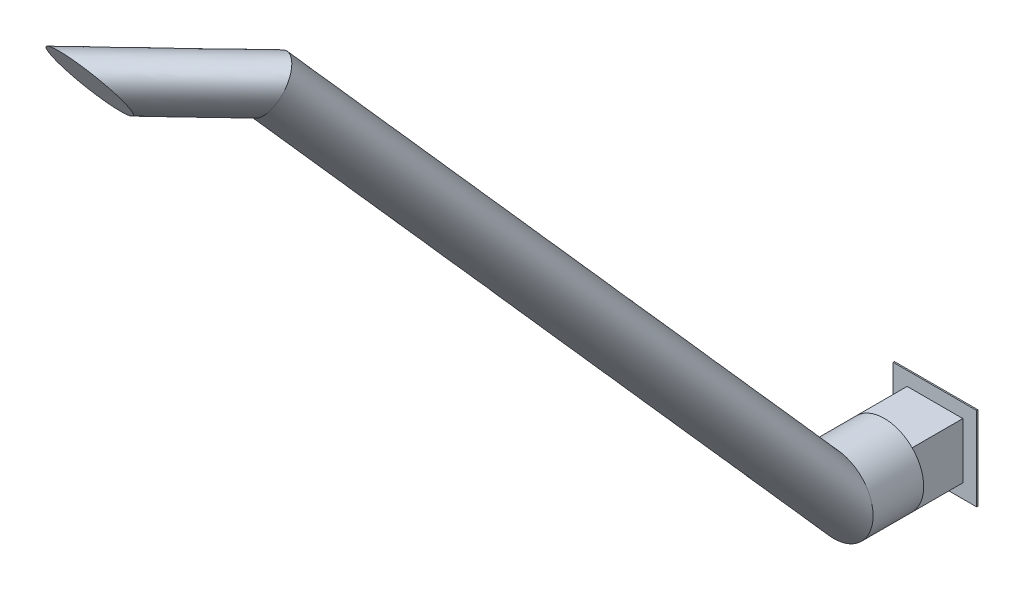
ISO-10303-21;
HEADER;
FILE_DESCRIPTION(('STEP AP214'),'2;1');
FILE_NAME('part.step','',(''),(''),'','','');
FILE_SCHEMA(('AUTOMOTIVE_DESIGN { 1 0 10303 214 1 1 1 1 }'));
ENDSEC;
DATA;
#1=APPLICATION_CONTEXT('core data for automotive mechanical design processes');
#2=APPLICATION_PROTOCOL_DEFINITION('international standard','automotive_design',2000,#1);
#3=PRODUCT_CONTEXT('',#1,'mechanical');
#4=PRODUCT('Part','Part','',(#3));
#5=PRODUCT_RELATED_PRODUCT_CATEGORY('part','',(#4));
#6=PRODUCT_DEFINITION_FORMATION('','',#4);
#7=PRODUCT_DEFINITION_CONTEXT('part definition',#1,'design');
#8=PRODUCT_DEFINITION('design','',#6,#7);
#9=PRODUCT_DEFINITION_SHAPE('','',#8);
#10=(LENGTH_UNIT() NAMED_UNIT(*) SI_UNIT(.MILLI.,.METRE.));
#11=(NAMED_UNIT(*) PLANE_ANGLE_UNIT() SI_UNIT($,.RADIAN.));
#12=(NAMED_UNIT(*) SI_UNIT($,.STERADIAN.) SOLID_ANGLE_UNIT());
#13=UNCERTAINTY_MEASURE_WITH_UNIT(LENGTH_MEASURE(1.E-05),#10,'distance_accuracy_value','');
#14=(GEOMETRIC_REPRESENTATION_CONTEXT(3) GLOBAL_UNCERTAINTY_ASSIGNED_CONTEXT((#13)) GLOBAL_UNIT_ASSIGNED_CONTEXT((#10,
#11,#12)) REPRESENTATION_CONTEXT('',''));
#15=CARTESIAN_POINT('',(0.,0.,0.));
#16=DIRECTION('',(0.,0.,1.));
#17=DIRECTION('',(1.,0.,0.));
#18=AXIS2_PLACEMENT_3D('',#15,#16,#17);
#19=CARTESIAN_POINT('',(0.,0.,2.5));
#20=DIRECTION('',(0.,0.,1.));
#21=DIRECTION('',(1.,0.,0.));
#22=AXIS2_PLACEMENT_3D('',#19,#20,#21);
#23=PLANE('',#22);
#24=DIRECTION('',(0.,-1.,0.));
#25=VECTOR('',#24,1.);
#26=CARTESIAN_POINT('',(0.,0.,2.5));
#27=LINE('',#26,#25);
#28=CARTESIAN_POINT('',(0.,0.,2.5));
#29=VERTEX_POINT('',#28);
#30=CARTESIAN_POINT('',(0.,-165.,2.5));
#31=VERTEX_POINT('',#30);
#32=EDGE_CURVE('E254',#29,#31,#27,.T.);
#33=ORIENTED_EDGE('',*,*,#32,.T.);
#34=DIRECTION('',(1.,0.,0.));
#35=VECTOR('',#34,1.);
#36=CARTESIAN_POINT('',(0.,-165.,2.5));
#37=LINE('',#36,#35);
#38=CARTESIAN_POINT('',(165.,-165.,2.5));
#39=VERTEX_POINT('',#38);
#40=EDGE_CURVE('E267',#31,#39,#37,.T.);
#41=ORIENTED_EDGE('',*,*,#40,.T.);
#42=DIRECTION('',(0.,1.,0.));
#43=VECTOR('',#42,1.);
#44=CARTESIAN_POINT('',(165.,0.,2.5));
#45=LINE('',#44,#43);
#46=CARTESIAN_POINT('',(165.,0.,2.5));
#47=VERTEX_POINT('',#46);
#48=EDGE_CURVE('E247',#39,#47,#45,.T.);
#49=ORIENTED_EDGE('',*,*,#48,.T.);
#50=DIRECTION('',(-1.,0.,0.));
#51=VECTOR('',#50,1.);
#52=CARTESIAN_POINT('',(0.,0.,2.5));
#53=LINE('',#52,#51);
#54=EDGE_CURVE('E261',#47,#29,#53,.T.);
#55=ORIENTED_EDGE('',*,*,#54,.T.);
#56=EDGE_LOOP('',(#33,#41,#49,#55));
#57=FACE_BOUND('',#56,.T.);
#58=DIRECTION('',(0.,-1.,0.));
#59=VECTOR('',#58,1.);
#60=CARTESIAN_POINT('',(27.5,-27.5,2.5));
#61=LINE('',#60,#59);
#62=CARTESIAN_POINT('',(27.5,-27.5,2.5));
#63=VERTEX_POINT('',#62);
#64=CARTESIAN_POINT('',(27.5,-137.5,2.5));
#65=VERTEX_POINT('',#64);
#66=EDGE_CURVE('E283',#63,#65,#61,.T.);
#67=ORIENTED_EDGE('',*,*,#66,.F.);
#68=DIRECTION('',(-1.,0.,0.));
#69=VECTOR('',#68,1.);
#70=CARTESIAN_POINT('',(27.5,-27.5,2.5));
#71=LINE('',#70,#69);
#72=CARTESIAN_POINT('',(137.5,-27.5,2.5));
#73=VERTEX_POINT('',#72);
#74=EDGE_CURVE('E286',#73,#63,#71,.T.);
#75=ORIENTED_EDGE('',*,*,#74,.F.);
#76=DIRECTION('',(0.,1.,0.));
#77=VECTOR('',#76,1.);
#78=CARTESIAN_POINT('',(137.5,-27.5,2.5));
#79=LINE('',#78,#77);
#80=CARTESIAN_POINT('',(137.5,-137.5,2.5));
#81=VERTEX_POINT('',#80);
#82=EDGE_CURVE('E290',#81,#73,#79,.T.);
#83=ORIENTED_EDGE('',*,*,#82,.F.);
#84=DIRECTION('',(1.,0.,0.));
#85=VECTOR('',#84,1.);
#86=CARTESIAN_POINT('',(27.5,-137.5,2.5));
#87=LINE('',#86,#85);
#88=EDGE_CURVE('E287',#65,#81,#87,.T.);
#89=ORIENTED_EDGE('',*,*,#88,.F.);
#90=EDGE_LOOP('',(#67,#75,#83,#89));
#91=FACE_BOUND('',#90,.T.);
#92=ADVANCED_FACE('F32',(#57,#91),#23,.T.);
#93=CARTESIAN_POINT('',(0.,0.,0.));
#94=DIRECTION('',(0.,0.,1.));
#95=DIRECTION('',(1.,0.,0.));
#96=AXIS2_PLACEMENT_3D('',#93,#94,#95);
#97=PLANE('',#96);
#98=DIRECTION('',(0.,-1.,0.));
#99=VECTOR('',#98,1.);
#100=CARTESIAN_POINT('',(0.,0.,0.));
#101=LINE('',#100,#99);
#102=CARTESIAN_POINT('',(0.,0.,0.));
#103=VERTEX_POINT('',#102);
#104=CARTESIAN_POINT('',(0.,-165.,0.));
#105=VERTEX_POINT('',#104);
#106=EDGE_CURVE('E243',#103,#105,#101,.T.);
#107=ORIENTED_EDGE('',*,*,#106,.F.);
#108=DIRECTION('',(-1.,0.,0.));
#109=VECTOR('',#108,1.);
#110=CARTESIAN_POINT('',(0.,0.,0.));
#111=LINE('',#110,#109);
#112=CARTESIAN_POINT('',(165.,0.,0.));
#113=VERTEX_POINT('',#112);
#114=EDGE_CURVE('E252',#113,#103,#111,.T.);
#115=ORIENTED_EDGE('',*,*,#114,.F.);
#116=DIRECTION('',(0.,1.,0.));
#117=VECTOR('',#116,1.);
#118=CARTESIAN_POINT('',(165.,0.,0.));
#119=LINE('',#118,#117);
#120=CARTESIAN_POINT('',(165.,-165.,0.));
#121=VERTEX_POINT('',#120);
#122=EDGE_CURVE('E242',#121,#113,#119,.T.);
#123=ORIENTED_EDGE('',*,*,#122,.F.);
#124=DIRECTION('',(1.,0.,0.));
#125=VECTOR('',#124,1.);
#126=CARTESIAN_POINT('',(0.,-165.,0.));
#127=LINE('',#126,#125);
#128=EDGE_CURVE('E235',#105,#121,#127,.T.);
#129=ORIENTED_EDGE('',*,*,#128,.F.);
#130=EDGE_LOOP('',(#107,#115,#123,#129));
#131=FACE_BOUND('',#130,.T.);
#132=DIRECTION('',(0.,1.,0.));
#133=VECTOR('',#132,1.);
#134=CARTESIAN_POINT('',(135.,-135.,0.));
#135=LINE('',#134,#133);
#136=CARTESIAN_POINT('',(135.,-135.,0.));
#137=VERTEX_POINT('',#136);
#138=CARTESIAN_POINT('',(135.,-30.,0.));
#139=VERTEX_POINT('',#138);
#140=EDGE_CURVE('E56',#137,#139,#135,.T.);
#141=ORIENTED_EDGE('',*,*,#140,.T.);
#142=DIRECTION('',(-1.,0.,0.));
#143=VECTOR('',#142,1.);
#144=CARTESIAN_POINT('',(30.,-30.,0.));
#145=LINE('',#144,#143);
#146=CARTESIAN_POINT('',(30.,-30.,0.));
#147=VERTEX_POINT('',#146);
#148=EDGE_CURVE('E308',#139,#147,#145,.T.);
#149=ORIENTED_EDGE('',*,*,#148,.T.);
#150=DIRECTION('',(0.,-1.,0.));
#151=VECTOR('',#150,1.);
#152=CARTESIAN_POINT('',(30.,-135.,0.));
#153=LINE('',#152,#151);
#154=CARTESIAN_POINT('',(30.,-135.,0.));
#155=VERTEX_POINT('',#154);
#156=EDGE_CURVE('E311',#147,#155,#153,.T.);
#157=ORIENTED_EDGE('',*,*,#156,.T.);
#158=DIRECTION('',(1.,0.,0.));
#159=VECTOR('',#158,1.);
#160=CARTESIAN_POINT('',(30.,-135.,0.));
#161=LINE('',#160,#159);
#162=EDGE_CURVE('E314',#155,#137,#161,.T.);
#163=ORIENTED_EDGE('',*,*,#162,.T.);
#164=EDGE_LOOP('',(#141,#149,#157,#163));
#165=FACE_BOUND('',#164,.T.);
#166=ADVANCED_FACE('F216',(#131,#165),#97,.F.);
#167=CARTESIAN_POINT('',(0.,0.,2.5));
#168=DIRECTION('',(1.,0.,0.));
#169=DIRECTION('',(0.,1.,0.));
#170=AXIS2_PLACEMENT_3D('',#167,#168,#169);
#171=PLANE('',#170);
#172=ORIENTED_EDGE('',*,*,#106,.T.);
#173=DIRECTION('',(0.,0.,-1.));
#174=VECTOR('',#173,1.);
#175=CARTESIAN_POINT('',(0.,-165.,2.5));
#176=LINE('',#175,#174);
#177=EDGE_CURVE('E11',#31,#105,#176,.T.);
#178=ORIENTED_EDGE('',*,*,#177,.F.);
#179=ORIENTED_EDGE('',*,*,#32,.F.);
#180=DIRECTION('',(0.,0.,-1.));
#181=VECTOR('',#180,1.);
#182=CARTESIAN_POINT('',(0.,0.,2.5));
#183=LINE('',#182,#181);
#184=EDGE_CURVE('E258',#29,#103,#183,.T.);
#185=ORIENTED_EDGE('',*,*,#184,.T.);
#186=EDGE_LOOP('',(#172,#178,#179,#185));
#187=FACE_BOUND('',#186,.T.);
#188=ADVANCED_FACE('F34',(#187),#171,.F.);
#189=CARTESIAN_POINT('',(0.,-165.,2.5));
#190=DIRECTION('',(0.,1.,0.));
#191=DIRECTION('',(0.,0.,1.));
#192=AXIS2_PLACEMENT_3D('',#189,#190,#191);
#193=PLANE('',#192);
#194=ORIENTED_EDGE('',*,*,#128,.T.);
#195=DIRECTION('',(0.,0.,-1.));
#196=VECTOR('',#195,1.);
#197=CARTESIAN_POINT('',(165.,-165.,2.5));
#198=LINE('',#197,#196);
#199=EDGE_CURVE('E41',#39,#121,#198,.T.);
#200=ORIENTED_EDGE('',*,*,#199,.F.);
#201=ORIENTED_EDGE('',*,*,#40,.F.);
#202=ORIENTED_EDGE('',*,*,#177,.T.);
#203=EDGE_LOOP('',(#194,#200,#201,#202));
#204=FACE_BOUND('',#203,.T.);
#205=ADVANCED_FACE('F226',(#204),#193,.F.);
#206=CARTESIAN_POINT('',(165.,0.,2.5));
#207=DIRECTION('',(-1.,0.,0.));
#208=DIRECTION('',(0.,-1.,0.));
#209=AXIS2_PLACEMENT_3D('',#206,#207,#208);
#210=PLANE('',#209);
#211=ORIENTED_EDGE('',*,*,#122,.T.);
#212=DIRECTION('',(0.,0.,-1.));
#213=VECTOR('',#212,1.);
#214=CARTESIAN_POINT('',(165.,0.,2.5));
#215=LINE('',#214,#213);
#216=EDGE_CURVE('E248',#47,#113,#215,.T.);
#217=ORIENTED_EDGE('',*,*,#216,.F.);
#218=ORIENTED_EDGE('',*,*,#48,.F.);
#219=ORIENTED_EDGE('',*,*,#199,.T.);
#220=EDGE_LOOP('',(#211,#217,#218,#219));
#221=FACE_BOUND('',#220,.T.);
#222=ADVANCED_FACE('F223',(#221),#210,.F.);
#223=CARTESIAN_POINT('',(0.,0.,2.5));
#224=DIRECTION('',(0.,-1.,0.));
#225=DIRECTION('',(0.,0.,-1.));
#226=AXIS2_PLACEMENT_3D('',#223,#224,#225);
#227=PLANE('',#226);
#228=ORIENTED_EDGE('',*,*,#114,.T.);
#229=ORIENTED_EDGE('',*,*,#184,.F.);
#230=ORIENTED_EDGE('',*,*,#54,.F.);
#231=ORIENTED_EDGE('',*,*,#216,.T.);
#232=EDGE_LOOP('',(#228,#229,#230,#231));
#233=FACE_BOUND('',#232,.T.);
#234=ADVANCED_FACE('F213',(#233),#227,.F.);
#235=CARTESIAN_POINT('',(135.,-135.,2.5));
#236=DIRECTION('',(-1.,0.,0.));
#237=DIRECTION('',(0.,0.,1.));
#238=AXIS2_PLACEMENT_3D('',#235,#236,#237);
#239=PLANE('',#238);
#240=ORIENTED_EDGE('',*,*,#140,.F.);
#241=DIRECTION('',(0.,0.,-1.));
#242=VECTOR('',#241,1.);
#243=CARTESIAN_POINT('',(135.,-135.,2.5));
#244=LINE('',#243,#242);
#245=CARTESIAN_POINT('',(135.,-135.,102.5));
#246=VERTEX_POINT('',#245);
#247=EDGE_CURVE('E317',#246,#137,#244,.T.);
#248=ORIENTED_EDGE('',*,*,#247,.F.);
#249=DIRECTION('',(0.,1.,0.));
#250=VECTOR('',#249,1.);
#251=CARTESIAN_POINT('',(135.,-30.,102.5));
#252=LINE('',#251,#250);
#253=CARTESIAN_POINT('',(135.,-30.,102.5));
#254=VERTEX_POINT('',#253);
#255=EDGE_CURVE('E327',#246,#254,#252,.T.);
#256=ORIENTED_EDGE('',*,*,#255,.T.);
#257=DIRECTION('',(0.,0.,-1.));
#258=VECTOR('',#257,1.);
#259=CARTESIAN_POINT('',(135.,-30.,2.5));
#260=LINE('',#259,#258);
#261=EDGE_CURVE('E270',#254,#139,#260,.T.);
#262=ORIENTED_EDGE('',*,*,#261,.T.);
#263=EDGE_LOOP('',(#240,#248,#256,#262));
#264=FACE_BOUND('',#263,.T.);
#265=ADVANCED_FACE('F209',(#264),#239,.T.);
#266=CARTESIAN_POINT('',(30.,-30.,2.5));
#267=DIRECTION('',(0.,-1.,0.));
#268=DIRECTION('',(0.,0.,-1.));
#269=AXIS2_PLACEMENT_3D('',#266,#267,#268);
#270=PLANE('',#269);
#271=ORIENTED_EDGE('',*,*,#148,.F.);
#272=ORIENTED_EDGE('',*,*,#261,.F.);
#273=DIRECTION('',(-1.,0.,0.));
#274=VECTOR('',#273,1.);
#275=CARTESIAN_POINT('',(30.,-30.,102.5));
#276=LINE('',#275,#274);
#277=CARTESIAN_POINT('',(30.,-30.,102.5));
#278=VERTEX_POINT('',#277);
#279=EDGE_CURVE('E292',#254,#278,#276,.T.);
#280=ORIENTED_EDGE('',*,*,#279,.T.);
#281=DIRECTION('',(0.,0.,-1.));
#282=VECTOR('',#281,1.);
#283=CARTESIAN_POINT('',(30.,-30.,2.5));
#284=LINE('',#283,#282);
#285=EDGE_CURVE('E271',#278,#147,#284,.T.);
#286=ORIENTED_EDGE('',*,*,#285,.T.);
#287=EDGE_LOOP('',(#271,#272,#280,#286));
#288=FACE_BOUND('',#287,.T.);
#289=ADVANCED_FACE('F205',(#288),#270,.T.);
#290=CARTESIAN_POINT('',(30.,-135.,2.5));
#291=DIRECTION('',(1.,0.,0.));
#292=DIRECTION('',(0.,0.,-1.));
#293=AXIS2_PLACEMENT_3D('',#290,#291,#292);
#294=PLANE('',#293);
#295=ORIENTED_EDGE('',*,*,#156,.F.);
#296=ORIENTED_EDGE('',*,*,#285,.F.);
#297=DIRECTION('',(0.,-1.,0.));
#298=VECTOR('',#297,1.);
#299=CARTESIAN_POINT('',(30.,-30.,102.5));
#300=LINE('',#299,#298);
#301=CARTESIAN_POINT('',(30.,-135.,102.5));
#302=VERTEX_POINT('',#301);
#303=EDGE_CURVE('E323',#278,#302,#300,.T.);
#304=ORIENTED_EDGE('',*,*,#303,.T.);
#305=DIRECTION('',(0.,0.,-1.));
#306=VECTOR('',#305,1.);
#307=CARTESIAN_POINT('',(30.,-135.,2.5));
#308=LINE('',#307,#306);
#309=EDGE_CURVE('E275',#302,#155,#308,.T.);
#310=ORIENTED_EDGE('',*,*,#309,.T.);
#311=EDGE_LOOP('',(#295,#296,#304,#310));
#312=FACE_BOUND('',#311,.T.);
#313=ADVANCED_FACE('F201',(#312),#294,.T.);
#314=CARTESIAN_POINT('',(30.,-135.,2.5));
#315=DIRECTION('',(0.,1.,0.));
#316=DIRECTION('',(0.,0.,1.));
#317=AXIS2_PLACEMENT_3D('',#314,#315,#316);
#318=PLANE('',#317);
#319=ORIENTED_EDGE('',*,*,#162,.F.);
#320=ORIENTED_EDGE('',*,*,#309,.F.);
#321=DIRECTION('',(1.,0.,0.));
#322=VECTOR('',#321,1.);
#323=CARTESIAN_POINT('',(30.,-135.,102.5));
#324=LINE('',#323,#322);
#325=EDGE_CURVE('E329',#302,#246,#324,.T.);
#326=ORIENTED_EDGE('',*,*,#325,.T.);
#327=ORIENTED_EDGE('',*,*,#247,.T.);
#328=EDGE_LOOP('',(#319,#320,#326,#327));
#329=FACE_BOUND('',#328,.T.);
#330=ADVANCED_FACE('F197',(#329),#318,.T.);
#331=CARTESIAN_POINT('',(27.5,-27.5,102.5));
#332=DIRECTION('',(0.,-1.,0.));
#333=DIRECTION('',(0.,0.,-1.));
#334=AXIS2_PLACEMENT_3D('',#331,#332,#333);
#335=PLANE('',#334);
#336=ORIENTED_EDGE('',*,*,#74,.T.);
#337=DIRECTION('',(0.,0.,-1.));
#338=VECTOR('',#337,1.);
#339=CARTESIAN_POINT('',(27.5,-27.5,102.5));
#340=LINE('',#339,#338);
#341=CARTESIAN_POINT('',(27.5,-27.5,102.5));
#342=VERTEX_POINT('',#341);
#343=EDGE_CURVE('E305',#342,#63,#340,.T.);
#344=ORIENTED_EDGE('',*,*,#343,.F.);
#345=DIRECTION('',(-1.,0.,0.));
#346=VECTOR('',#345,1.);
#347=CARTESIAN_POINT('',(27.5,-27.5,102.5));
#348=LINE('',#347,#346);
#349=CARTESIAN_POINT('',(137.5,-27.5,102.5));
#350=VERTEX_POINT('',#349);
#351=EDGE_CURVE('E297',#350,#342,#348,.T.);
#352=ORIENTED_EDGE('',*,*,#351,.F.);
#353=DIRECTION('',(0.,0.,-1.));
#354=VECTOR('',#353,1.);
#355=CARTESIAN_POINT('',(137.5,-27.5,102.5));
#356=LINE('',#355,#354);
#357=EDGE_CURVE('E298',#350,#73,#356,.T.);
#358=ORIENTED_EDGE('',*,*,#357,.T.);
#359=EDGE_LOOP('',(#336,#344,#352,#358));
#360=FACE_BOUND('',#359,.T.);
#361=ADVANCED_FACE('F193',(#360),#335,.F.);
#362=CARTESIAN_POINT('',(27.5,-27.5,102.5));
#363=DIRECTION('',(1.,0.,0.));
#364=DIRECTION('',(0.,0.,-1.));
#365=AXIS2_PLACEMENT_3D('',#362,#363,#364);
#366=PLANE('',#365);
#367=ORIENTED_EDGE('',*,*,#66,.T.);
#368=DIRECTION('',(0.,0.,-1.));
#369=VECTOR('',#368,1.);
#370=CARTESIAN_POINT('',(27.5,-137.5,102.5));
#371=LINE('',#370,#369);
#372=CARTESIAN_POINT('',(27.5,-137.5,102.5));
#373=VERTEX_POINT('',#372);
#374=EDGE_CURVE('E303',#373,#65,#371,.T.);
#375=ORIENTED_EDGE('',*,*,#374,.F.);
#376=DIRECTION('',(0.,-1.,0.));
#377=VECTOR('',#376,1.);
#378=CARTESIAN_POINT('',(27.5,-27.5,102.5));
#379=LINE('',#378,#377);
#380=EDGE_CURVE('E335',#342,#373,#379,.T.);
#381=ORIENTED_EDGE('',*,*,#380,.F.);
#382=ORIENTED_EDGE('',*,*,#343,.T.);
#383=EDGE_LOOP('',(#367,#375,#381,#382));
#384=FACE_BOUND('',#383,.T.);
#385=ADVANCED_FACE('F189',(#384),#366,.F.);
#386=CARTESIAN_POINT('',(27.5,-137.5,102.5));
#387=DIRECTION('',(0.,1.,0.));
#388=DIRECTION('',(0.,0.,1.));
#389=AXIS2_PLACEMENT_3D('',#386,#387,#388);
#390=PLANE('',#389);
#391=ORIENTED_EDGE('',*,*,#88,.T.);
#392=DIRECTION('',(0.,0.,-1.));
#393=VECTOR('',#392,1.);
#394=CARTESIAN_POINT('',(137.5,-137.5,102.5));
#395=LINE('',#394,#393);
#396=CARTESIAN_POINT('',(137.5,-137.5,102.5));
#397=VERTEX_POINT('',#396);
#398=EDGE_CURVE('E48',#397,#81,#395,.T.);
#399=ORIENTED_EDGE('',*,*,#398,.F.);
#400=DIRECTION('',(1.,0.,0.));
#401=VECTOR('',#400,1.);
#402=CARTESIAN_POINT('',(27.5,-137.5,102.5));
#403=LINE('',#402,#401);
#404=EDGE_CURVE('E338',#373,#397,#403,.T.);
#405=ORIENTED_EDGE('',*,*,#404,.F.);
#406=ORIENTED_EDGE('',*,*,#374,.T.);
#407=EDGE_LOOP('',(#391,#399,#405,#406));
#408=FACE_BOUND('',#407,.T.);
#409=ADVANCED_FACE('F186',(#408),#390,.F.);
#410=CARTESIAN_POINT('',(137.5,-27.5,102.5));
#411=DIRECTION('',(-1.,0.,0.));
#412=DIRECTION('',(0.,0.,1.));
#413=AXIS2_PLACEMENT_3D('',#410,#411,#412);
#414=PLANE('',#413);
#415=ORIENTED_EDGE('',*,*,#82,.T.);
#416=ORIENTED_EDGE('',*,*,#357,.F.);
#417=DIRECTION('',(0.,1.,0.));
#418=VECTOR('',#417,1.);
#419=CARTESIAN_POINT('',(137.5,-27.5,102.5));
#420=LINE('',#419,#418);
#421=EDGE_CURVE('E301',#397,#350,#420,.T.);
#422=ORIENTED_EDGE('',*,*,#421,.F.);
#423=ORIENTED_EDGE('',*,*,#398,.T.);
#424=EDGE_LOOP('',(#415,#416,#422,#423));
#425=FACE_BOUND('',#424,.T.);
#426=ADVANCED_FACE('F183',(#425),#414,.F.);
#427=CARTESIAN_POINT('',(82.5,-82.5,102.5));
#428=DIRECTION('',(0.,0.,1.));
#429=DIRECTION('',(1.,0.,0.));
#430=AXIS2_PLACEMENT_3D('',#427,#428,#429);
#431=PLANE('',#430);
#432=ORIENTED_EDGE('',*,*,#303,.F.);
#433=ORIENTED_EDGE('',*,*,#279,.F.);
#434=ORIENTED_EDGE('',*,*,#255,.F.);
#435=ORIENTED_EDGE('',*,*,#325,.F.);
#436=EDGE_LOOP('',(#432,#433,#434,#435));
#437=FACE_BOUND('',#436,.T.);
#438=ADVANCED_FACE('F178',(#437),#431,.F.);
#439=CARTESIAN_POINT('',(82.5,-82.5,102.5));
#440=DIRECTION('',(0.,0.,1.));
#441=DIRECTION('',(1.,0.,0.));
#442=AXIS2_PLACEMENT_3D('',#439,#440,#441);
#443=CIRCLE('',#442,77.7817459305202);
#444=EDGE_CURVE('E138',#350,#342,#443,.T.);
#445=ORIENTED_EDGE('',*,*,#444,.F.);
#446=ORIENTED_EDGE('',*,*,#351,.T.);
#447=EDGE_LOOP('',(#445,#446));
#448=FACE_BOUND('',#447,.T.);
#449=ADVANCED_FACE('F177',(#448),#431,.F.);
#450=EDGE_CURVE('E351',#342,#373,#443,.T.);
#451=ORIENTED_EDGE('',*,*,#450,.F.);
#452=ORIENTED_EDGE('',*,*,#380,.T.);
#453=EDGE_LOOP('',(#451,#452));
#454=FACE_BOUND('',#453,.T.);
#455=ADVANCED_FACE('F354',(#454),#431,.F.);
#456=EDGE_CURVE('E136',#373,#397,#443,.T.);
#457=ORIENTED_EDGE('',*,*,#456,.F.);
#458=ORIENTED_EDGE('',*,*,#404,.T.);
#459=EDGE_LOOP('',(#457,#458));
#460=FACE_BOUND('',#459,.T.);
#461=ADVANCED_FACE('F181',(#460),#431,.F.);
#462=CARTESIAN_POINT('',(82.5,-82.5,202.5));
#463=DIRECTION('',(0.,0.,-1.));
#464=DIRECTION('',(-1.,0.,0.));
#465=AXIS2_PLACEMENT_3D('',#462,#463,#464);
#466=CYLINDRICAL_SURFACE('',#465,77.7817459305202);
#467=CARTESIAN_POINT('',(82.5,-82.5,202.5));
#468=DIRECTION('',(0.,0.,1.));
#469=DIRECTION('',(1.,0.,0.));
#470=AXIS2_PLACEMENT_3D('',#467,#468,#469);
#471=CIRCLE('',#470,77.7817459305202);
#472=CARTESIAN_POINT('',(160.28174593052,-82.5,202.5));
#473=VERTEX_POINT('',#472);
#474=EDGE_CURVE('E36',#473,#473,#471,.T.);
#475=ORIENTED_EDGE('',*,*,#474,.F.);
#476=EDGE_LOOP('',(#475));
#477=FACE_BOUND('',#476,.T.);
#478=ORIENTED_EDGE('',*,*,#444,.T.);
#479=ORIENTED_EDGE('',*,*,#450,.T.);
#480=ORIENTED_EDGE('',*,*,#456,.T.);
#481=EDGE_CURVE('E132',#397,#350,#443,.T.);
#482=ORIENTED_EDGE('',*,*,#481,.T.);
#483=EDGE_LOOP('',(#478,#479,#480,#482));
#484=FACE_BOUND('',#483,.T.);
#485=ADVANCED_FACE('F175',(#477,#484),#466,.T.);
#486=ORIENTED_EDGE('',*,*,#481,.F.);
#487=ORIENTED_EDGE('',*,*,#421,.T.);
#488=EDGE_LOOP('',(#486,#487));
#489=FACE_BOUND('',#488,.T.);
#490=ADVANCED_FACE('F154',(#489),#431,.F.);
#491=CARTESIAN_POINT('',(-499.65420624568,774.591548600483,1089.67792133919));
#492=DIRECTION('',(-0.048571803509788,-0.562168981128697,0.82559482590465));
#493=DIRECTION('',(0.808383262570436,0.463354338060489,0.363069219566328));
#494=AXIS2_PLACEMENT_3D('',#491,#492,#493);
#495=PLANE('',#494);
#496=CARTESIAN_POINT('',(-499.65420624568,774.591548600483,1089.67792133919));
#497=DIRECTION('',(-0.048571803509788,-0.562168981128697,0.82559482590465));
#498=DIRECTION('',(0.808383262570436,0.463354338060489,0.363069219566328));
#499=AXIS2_PLACEMENT_3D('',#496,#497,#498);
#500=CIRCLE('',#499,77.7817459305202);
#501=CARTESIAN_POINT('',(-436.776744701941,810.632057999309,1117.91807913069));
#502=VERTEX_POINT('',#501);
#503=EDGE_CURVE('E133',#502,#502,#500,.T.);
#504=ORIENTED_EDGE('',*,*,#503,.T.);
#505=EDGE_LOOP('',(#504));
#506=FACE_BOUND('',#505,.T.);
#507=ADVANCED_FACE('F164',(#506),#495,.T.);
#508=CARTESIAN_POINT('',(-283.407466885606,868.205686274757,995.28380440967));
#509=CARTESIAN_POINT('',(160.28174593052,-82.5,202.5));
#510=CARTESIAN_POINT('',(-283.407466885606,1023.7691781358,995.283804409671));
#511=CARTESIAN_POINT('',(160.28174593052,73.0634918610403,202.5));
#512=CARTESIAN_POINT('',(-438.970958746646,1023.7691781358,995.283804409671));
#513=CARTESIAN_POINT('',(4.71825406947979,73.0634918610403,202.5));
#514=CARTESIAN_POINT('',(-438.970958746646,868.205686274757,995.28380440967));
#515=CARTESIAN_POINT('',(4.71825406947979,-82.5,202.5));
#516=CARTESIAN_POINT('',(-438.970958746646,712.642194413717,995.283804409671));
#517=CARTESIAN_POINT('',(4.71825406947979,-238.06349186104,202.5));
#518=CARTESIAN_POINT('',(-283.407466885606,712.642194413717,995.283804409671));
#519=CARTESIAN_POINT('',(160.28174593052,-238.06349186104,202.5));
#520=CARTESIAN_POINT('',(-283.407466885606,868.205686274757,995.28380440967));
#521=CARTESIAN_POINT('',(160.28174593052,-82.5,202.5));
#522=(BOUNDED_SURFACE() B_SPLINE_SURFACE(3,1,((#508,#509),(#510,#511),(#512,#513),(#514,#515),
(#516,#517),(#518,#519),(#520,#521)),.UNSPECIFIED.,.T.,.F.,.F.) B_SPLINE_SURFACE_WITH_KNOTS((4,
3,4),(2,2),(0.,0.5,1.),(0.,1.),
.UNSPECIFIED.) GEOMETRIC_REPRESENTATION_ITEM() RATIONAL_B_SPLINE_SURFACE(((1.,1.),
(0.333333333333333,0.333333333333333),(0.333333333333333,0.333333333333333),(1.,1.),
(0.333333333333333,0.333333333333333),(0.333333333333333,0.333333333333333),(1.,1.))) REPRESENTATION_ITEM('') SURFACE());
#523=CARTESIAN_POINT('',(-256.538165294914,810.632057999308,947.273741235727));
#524=CARTESIAN_POINT('',(-256.758852070678,809.603591299644,947.668067438799));
#525=CARTESIAN_POINT('',(-257.009801152548,808.572627135929,948.038849921184));
#526=CARTESIAN_POINT('',(-257.565525044,806.50984597856,948.73652813465));
#527=CARTESIAN_POINT('',(-257.870330450984,805.478028833742,949.063398731248));
#528=CARTESIAN_POINT('',(-258.527777853545,803.417334250116,949.676064722783));
#529=CARTESIAN_POINT('',(-258.88042853164,802.388457379566,949.961852642985));
#530=CARTESIAN_POINT('',(-259.629259121431,800.333968310309,950.495721446527));
#531=CARTESIAN_POINT('',(-260.025539534896,799.308369495668,950.743711994957));
#532=CARTESIAN_POINT('',(-260.856395544356,797.265042902576,951.203719275354));
#533=CARTESIAN_POINT('',(-261.290961283904,796.247313171219,951.415745225423));
#534=CARTESIAN_POINT('',(-262.194701300239,794.220788782587,951.806265786733));
#535=CARTESIAN_POINT('',(-262.66387797678,793.211994750312,951.984758069864));
#536=CARTESIAN_POINT('',(-263.553895127708,791.369372386172,952.283554057838));
#537=CARTESIAN_POINT('',(-263.970017843759,790.534020509866,952.40859986279));
#538=CARTESIAN_POINT('',(-264.822503836054,788.870766595987,952.63783473242));
#539=CARTESIAN_POINT('',(-265.258868265922,788.04286498624,952.742022606549));
#540=CARTESIAN_POINT('',(-266.150558646001,786.394540411762,952.930579693158));
#541=CARTESIAN_POINT('',(-266.605893743845,785.574121293021,953.014939211116));
#542=CARTESIAN_POINT('',(-267.534035591196,783.941455447113,953.164678886628));
#543=CARTESIAN_POINT('',(-268.00684328103,783.129209162788,953.230058021028));
#544=CARTESIAN_POINT('',(-269.449827786908,780.704906874028,953.398983378044));
#545=CARTESIAN_POINT('',(-270.44450012618,779.105408699482,953.475303939943));
#546=CARTESIAN_POINT('',(-272.492760154639,775.939176378207,953.561028699336));
#547=CARTESIAN_POINT('',(-273.546445334993,774.372502697147,953.570318664793));
#548=CARTESIAN_POINT('',(-275.704635084518,771.276188597164,953.526263197408));
#549=CARTESIAN_POINT('',(-276.809125472079,769.746538023501,953.472935142845));
#550=CARTESIAN_POINT('',(-279.064118253119,766.724705560885,953.307362050343));
#551=CARTESIAN_POINT('',(-280.214623459868,765.232525971952,953.195113404995));
#552=CARTESIAN_POINT('',(-282.220808328396,762.709865475229,952.954941768875));
#553=CARTESIAN_POINT('',(-283.066251911608,761.669878250981,952.840781752363));
#554=CARTESIAN_POINT('',(-284.777058197141,759.609799248451,952.584896982976));
#555=CARTESIAN_POINT('',(-285.642421533037,758.589708104902,952.443171352267));
#556=CARTESIAN_POINT('',(-287.392134085177,756.569554266115,952.13285003661));
#557=CARTESIAN_POINT('',(-288.276489158298,755.569497938684,951.96424595656));
#558=CARTESIAN_POINT('',(-290.062933541871,753.590131158144,951.600797424707));
#559=CARTESIAN_POINT('',(-290.965023659722,752.610821653784,951.405951775864));
#560=CARTESIAN_POINT('',(-292.786186280878,750.673260291136,950.990465125096));
#561=CARTESIAN_POINT('',(-293.705262746343,749.715013462922,950.769818039241));
#562=CARTESIAN_POINT('',(-295.559403570618,747.820323236403,950.303130358326));
#563=CARTESIAN_POINT('',(-296.494468760682,746.883880977732,950.057088439619));
#564=CARTESIAN_POINT('',(-298.379599074064,745.03366097893,949.539942950869));
#565=CARTESIAN_POINT('',(-299.329661281289,744.119878919358,949.268844204413));
#566=CARTESIAN_POINT('',(-301.244213887971,742.315557353937,948.701732446592));
#567=CARTESIAN_POINT('',(-302.20870353812,741.425016647564,948.405720725448));
#568=CARTESIAN_POINT('',(-304.151278040073,739.668156656092,947.788921157872));
#569=CARTESIAN_POINT('',(-305.129359567414,738.801831598886,947.468139285503));
#570=CARTESIAN_POINT('',(-307.098689629349,737.094149759581,946.801733902525));
#571=CARTESIAN_POINT('',(-308.089937572306,736.252791861031,946.456111505074));
#572=CARTESIAN_POINT('',(-310.084741906097,734.596328103453,945.740013460578));
#573=CARTESIAN_POINT('',(-311.088294230953,733.78121387874,945.369545851885));
#574=CARTESIAN_POINT('',(-313.107398928202,732.178206610841,944.603468592523));
#575=CARTESIAN_POINT('',(-314.122950894839,731.390312650742,944.207859790013));
#576=CARTESIAN_POINT('',(-316.516417600772,729.577290922468,943.250889004726));
#577=CARTESIAN_POINT('',(-317.898969689224,728.563645071012,942.679271791261));
#578=CARTESIAN_POINT('',(-320.683211196091,726.591936762669,941.489122009219));
#579=CARTESIAN_POINT('',(-322.084899002223,725.633869658256,940.87059337341));
#580=CARTESIAN_POINT('',(-324.906259540184,723.77778483298,939.585068415825));
#581=CARTESIAN_POINT('',(-326.325935780618,722.879779048266,938.918062514664));
#582=CARTESIAN_POINT('',(-329.178213638005,721.151605525647,937.535389461984));
#583=CARTESIAN_POINT('',(-330.610783045269,720.321303362321,936.819824173449));
#584=CARTESIAN_POINT('',(-333.489357955041,718.733599457579,935.336775086848));
#585=CARTESIAN_POINT('',(-334.935361514521,717.976187348409,934.569298699047));
#586=CARTESIAN_POINT('',(-337.111863896865,716.901466934786,933.377505364536));
#587=CARTESIAN_POINT('',(-337.838499607484,716.553509533443,932.973544353499));
#588=CARTESIAN_POINT('',(-339.293932669919,715.879283668668,932.15168892665));
#589=CARTESIAN_POINT('',(-340.022729922344,715.553014223652,931.733795142715));
#590=CARTESIAN_POINT('',(-341.619233870648,714.864368039565,930.803744725827));
#591=CARTESIAN_POINT('',(-342.487283550532,714.50674336845,930.288642941709));
#592=CARTESIAN_POINT('',(-344.224569133417,713.826833549206,929.237661881107));
#593=CARTESIAN_POINT('',(-345.093804929816,713.504545412968,928.701784366642));
#594=CARTESIAN_POINT('',(-346.832334770766,712.898330890121,927.60848828011));
#595=CARTESIAN_POINT('',(-347.701628808158,712.614409505384,927.051066911528));
#596=CARTESIAN_POINT('',(-349.43797143087,712.088695757252,925.914471186401));
#597=CARTESIAN_POINT('',(-350.305021081857,711.846877108189,925.335310678653));
#598=CARTESIAN_POINT('',(-352.035301880897,711.409228652497,924.154370671665));
#599=CARTESIAN_POINT('',(-352.89853331839,711.213395299241,923.55259292094));
#600=CARTESIAN_POINT('',(-354.618409516118,710.872380344452,922.326087527865));
#601=CARTESIAN_POINT('',(-355.475055969872,710.727185262438,921.70136604242));
#602=CARTESIAN_POINT('',(-357.245289689696,710.483468510527,920.378841121714));
#603=CARTESIAN_POINT('',(-358.158099203322,710.389477325172,919.67914042268));
#604=CARTESIAN_POINT('',(-359.967301500135,710.273833390892,918.252740857925));
#605=CARTESIAN_POINT('',(-360.863694205109,710.252180986511,917.52604186363));
#606=CARTESIAN_POINT('',(-362.63215421986,710.28943142254,916.04756058125));
#607=CARTESIAN_POINT('',(-363.504251324945,710.348230721895,915.29581174634));
#608=CARTESIAN_POINT('',(-365.216613789989,710.554967302356,913.768609037383));
#609=CARTESIAN_POINT('',(-366.056888848502,710.702877188615,912.993162518123));
#610=CARTESIAN_POINT('',(-367.491292900241,711.047500461446,911.617806209485));
#611=CARTESIAN_POINT('',(-368.094674830669,711.222934241053,911.022192294594));
#612=CARTESIAN_POINT('',(-369.272260316168,711.632296471177,909.822241065126));
#613=CARTESIAN_POINT('',(-369.846467230537,711.866218168772,909.217904765208));
#614=CARTESIAN_POINT('',(-370.959657573703,712.395135945733,908.004045961173));
#615=CARTESIAN_POINT('',(-371.498664981465,712.690089864878,907.394527314197));
#616=CARTESIAN_POINT('',(-372.27634720204,713.179458103748,906.479361589934));
#617=CARTESIAN_POINT('',(-372.530470817425,713.350431732162,906.174114390235));
#618=CARTESIAN_POINT('',(-373.027715523661,713.708096241121,905.563882608427));
#619=CARTESIAN_POINT('',(-373.270837434671,713.894785947081,905.258898008411));
#620=CARTESIAN_POINT('',(-373.82690584627,714.350748601216,904.545108409339));
#621=CARTESIAN_POINT('',(-374.135133719221,714.626353024206,904.136645272632));
#622=CARTESIAN_POINT('',(-374.728705380594,715.205537830916,903.322906486505));
#623=CARTESIAN_POINT('',(-375.014048191215,715.509119408817,902.917630973948));
#624=CARTESIAN_POINT('',(-375.560328219965,716.143485959488,902.111954350371));
#625=CARTESIAN_POINT('',(-375.821266139238,716.474270150224,901.711553099603));
#626=CARTESIAN_POINT('',(-376.317424723589,717.16183697747,900.917381205696));
#627=CARTESIAN_POINT('',(-376.552651089935,717.51861382102,900.52360910906));
#628=CARTESIAN_POINT('',(-376.996505073014,718.256781652734,899.744197661332));
#629=CARTESIAN_POINT('',(-377.20513189663,718.638173374328,899.358558553026));
#630=CARTESIAN_POINT('',(-377.595132404666,719.423734985382,898.596981094901));
#631=CARTESIAN_POINT('',(-377.776509331936,719.827902156586,898.221041595206));
#632=CARTESIAN_POINT('',(-378.167552525174,720.795119773075,897.35682779535));
#633=CARTESIAN_POINT('',(-378.366561727752,721.366302705674,896.872780912724));
#634=CARTESIAN_POINT('',(-378.715979829575,722.540674804927,895.926812560246));
#635=CARTESIAN_POINT('',(-378.866394197982,723.143860360907,895.464888605531));
#636=CARTESIAN_POINT('',(-379.11994667867,724.377448383025,894.564758122922));
#637=CARTESIAN_POINT('',(-379.22307229782,725.007857993363,894.126557889491));
#638=CARTESIAN_POINT('',(-379.383951666514,726.290910393232,893.275097453709));
#639=CARTESIAN_POINT('',(-379.441698099037,726.943556750563,892.861841283296));
#640=CARTESIAN_POINT('',(-379.529659874843,728.548271637559,891.890262661429));
#641=CARTESIAN_POINT('',(-379.537697850656,729.509556192674,891.345055885602));
#642=CARTESIAN_POINT('',(-379.474374958172,731.457001094864,890.306147700719));
#643=CARTESIAN_POINT('',(-379.402984449805,732.44317059392,889.812465594176));
#644=CARTESIAN_POINT('',(-379.188776941885,734.433040949728,888.874150613967));
#645=CARTESIAN_POINT('',(-379.045825208032,735.436771416739,888.429612202));
#646=CARTESIAN_POINT('',(-378.696241373163,737.452861422201,887.588187763032));
#647=CARTESIAN_POINT('',(-378.489608342365,738.465221086435,887.19130243191));
#648=CARTESIAN_POINT('',(-378.0113287288,740.529601725335,886.428896478401));
#649=CARTESIAN_POINT('',(-377.73761584422,741.58174270527,886.06501172017));
#650=CARTESIAN_POINT('',(-377.136287616836,743.685567919153,885.381925918177));
#651=CARTESIAN_POINT('',(-376.808646166766,744.737251683292,885.062746655925));
#652=CARTESIAN_POINT('',(-376.105523310702,746.836532517176,884.466108735007));
#653=CARTESIAN_POINT('',(-375.730034363569,747.884128915839,884.188656667935));
#654=CARTESIAN_POINT('',(-374.935804172309,749.974288279572,883.672222301515));
#655=CARTESIAN_POINT('',(-374.516995454502,751.01684066223,883.433301544776));
#656=CARTESIAN_POINT('',(-373.64116869758,753.093192268986,882.991857307941));
#657=CARTESIAN_POINT('',(-373.184159579381,754.126993474982,882.789325364591));
#658=CARTESIAN_POINT('',(-372.235606069486,756.184845497582,882.418189229888));
#659=CARTESIAN_POINT('',(-371.744059012274,757.208895554686,882.249587661048));
#660=CARTESIAN_POINT('',(-370.809442129669,759.086036747114,881.968211971929));
#661=CARTESIAN_POINT('',(-370.370895057298,759.94070167172,881.85082832918));
#662=CARTESIAN_POINT('',(-369.47326309827,761.641937482837,881.637523715971));
#663=CARTESIAN_POINT('',(-369.01417703302,762.488507901467,881.541603979078));
#664=CARTESIAN_POINT('',(-368.076761725648,764.173546618046,881.370164632106));
#665=CARTESIAN_POINT('',(-367.598423232778,765.012010775085,881.294654966774));
#666=CARTESIAN_POINT('',(-366.624022529519,766.68014574848,881.163170656714));
#667=CARTESIAN_POINT('',(-366.127959366758,767.509816089216,881.107197063432));
#668=CARTESIAN_POINT('',(-364.614846599087,769.985479384902,880.96729706975));
#669=CARTESIAN_POINT('',(-363.572944477988,771.617997996924,880.911404070378));
#670=CARTESIAN_POINT('',(-361.428950148186,774.848425065794,880.868619443183));
#671=CARTESIAN_POINT('',(-360.326739994033,776.446256497414,880.881868184223));
#672=CARTESIAN_POINT('',(-358.070686061562,779.602412605324,880.97305800977));
#673=CARTESIAN_POINT('',(-356.916856687669,781.160748115203,881.050981152009));
#674=CARTESIAN_POINT('',(-354.562440836501,784.237377817949,881.267799924736));
#675=CARTESIAN_POINT('',(-353.361851742244,785.755669761716,881.406698972319));
#676=CARTESIAN_POINT('',(-350.864146547753,788.817404385352,881.749965868299));
#677=CARTESIAN_POINT('',(-349.56511016527,790.358984729941,881.956959879365));
#678=CARTESIAN_POINT('',(-346.924527532205,793.396263018442,882.43169230841));
#679=CARTESIAN_POINT('',(-345.582971447007,794.891950187686,882.699444869091));
#680=CARTESIAN_POINT('',(-342.860667100461,797.835909979078,883.293818289208));
#681=CARTESIAN_POINT('',(-341.479908542183,799.284169924803,883.620454737897));
#682=CARTESIAN_POINT('',(-338.682158859541,802.131277573022,884.331275801188));
#683=CARTESIAN_POINT('',(-337.265160591295,803.530115401545,884.715471836079));
#684=CARTESIAN_POINT('',(-334.398646869183,806.274921988006,885.540286524896));
#685=CARTESIAN_POINT('',(-332.949153292324,807.620924730983,885.980868106326));
#686=CARTESIAN_POINT('',(-330.019235417345,810.258064473073,886.918264964802));
#687=CARTESIAN_POINT('',(-328.538816520685,811.549210935902,887.415070487561));
#688=CARTESIAN_POINT('',(-325.549304226892,814.073169221011,888.464999121407));
#689=CARTESIAN_POINT('',(-324.040219599446,815.305998493868,889.018105227203));
#690=CARTESIAN_POINT('',(-320.995322886989,817.70933767771,890.181262754867));
#691=CARTESIAN_POINT('',(-319.459518919469,818.879866092059,890.791297119152));
#692=CARTESIAN_POINT('',(-316.594415937814,820.983858017215,891.973980114924));
#693=CARTESIAN_POINT('',(-315.268591850943,821.926591376356,892.538570976091));
#694=CARTESIAN_POINT('',(-312.600144448475,823.759851871692,893.71084879184));
#695=CARTESIAN_POINT('',(-311.257522772983,824.650384057239,894.318531565589));
#696=CARTESIAN_POINT('',(-308.556580896764,826.375025963017,895.578448224228));
#697=CARTESIAN_POINT('',(-307.198258003293,827.209125831882,896.230689848002));
#698=CARTESIAN_POINT('',(-304.470153551219,828.813993428045,897.580100907614));
#699=CARTESIAN_POINT('',(-303.100395364936,829.584866285365,898.277192177878));
#700=CARTESIAN_POINT('',(-300.349439044037,831.058242564455,899.719109362805));
#701=CARTESIAN_POINT('',(-298.968242310586,831.760754229538,900.463929504088));
#702=CARTESIAN_POINT('',(-296.197388058528,833.08934793361,902.003364833226));
#703=CARTESIAN_POINT('',(-294.807734043284,833.715459622186,902.797960521659));
#704=CARTESIAN_POINT('',(-292.549176207306,834.661381683947,904.129548324996));
#705=CARTESIAN_POINT('',(-291.681799160467,835.007572166685,904.650501973069));
#706=CARTESIAN_POINT('',(-289.94621785561,835.663780545192,905.713357597734));
#707=CARTESIAN_POINT('',(-289.078013665192,835.973801177587,906.255257985352));
#708=CARTESIAN_POINT('',(-287.342020291756,836.554514790503,907.360750917456));
#709=CARTESIAN_POINT('',(-286.474231188615,836.825201976691,907.924346642513));
#710=CARTESIAN_POINT('',(-284.741664898226,837.323295350086,909.073304762944));
#711=CARTESIAN_POINT('',(-283.876885810844,837.550737221315,909.65864873167));
#712=CARTESIAN_POINT('',(-282.151897115502,837.958381763014,910.852037228063));
#713=CARTESIAN_POINT('',(-281.291687097005,838.138588750433,911.460079675436));
#714=CARTESIAN_POINT('',(-279.5788021505,838.446933630887,912.699126853538));
#715=CARTESIAN_POINT('',(-278.726125023696,838.575087244607,913.330124588701));
#716=CARTESIAN_POINT('',(-276.990051711786,838.778836957483,914.646886058229));
#717=CARTESIAN_POINT('',(-276.107194824871,838.851553427549,915.333818667045));
#718=CARTESIAN_POINT('',(-274.358500713472,838.926763096401,916.733000029419));
#719=CARTESIAN_POINT('',(-273.492663319546,838.929256994662,917.44524853074));
#720=CARTESIAN_POINT('',(-271.785625585172,838.856361684484,918.893074823781));
#721=CARTESIAN_POINT('',(-270.944396598726,838.78106706629,919.628623229931));
#722=CARTESIAN_POINT('',(-269.293849208299,838.544654951338,921.121502739168));
#723=CARTESIAN_POINT('',(-268.484521999483,838.383561315624,921.878827730732));
#724=CARTESIAN_POINT('',(-267.091716016652,838.01623959465,923.232615150837));
#725=CARTESIAN_POINT('',(-266.499575988263,837.829292397816,923.825413852262));
#726=CARTESIAN_POINT('',(-265.345218791676,837.397231139899,925.018937369796));
#727=CARTESIAN_POINT('',(-264.782998270243,837.152123614026,925.619661288227));
#728=CARTESIAN_POINT('',(-263.694467704049,836.601428013929,926.825396384542));
#729=CARTESIAN_POINT('',(-263.168133023792,836.295882004272,927.430404300009));
#730=CARTESIAN_POINT('',(-262.409875048571,835.791301404548,928.338083127814));
#731=CARTESIAN_POINT('',(-262.162296463782,835.615369054429,928.640713979866));
#732=CARTESIAN_POINT('',(-261.678254248613,835.248052773778,929.245471550083));
#733=CARTESIAN_POINT('',(-261.441789794719,835.056669990928,929.547598303995));
#734=CARTESIAN_POINT('',(-260.901594217324,834.590215748335,930.254183251569));
#735=CARTESIAN_POINT('',(-260.602603785507,834.308951733391,930.658203564226));
#736=CARTESIAN_POINT('',(-260.02754380117,833.719127858941,931.462645324401));
#737=CARTESIAN_POINT('',(-259.751475235152,833.410566825816,931.863066616365));
#738=CARTESIAN_POINT('',(-259.223677327317,832.767004781576,932.658661779457));
#739=CARTESIAN_POINT('',(-258.971947266974,832.432004551537,933.053835805198));
#740=CARTESIAN_POINT('',(-258.49400324972,831.7368009038,933.837273481202));
#741=CARTESIAN_POINT('',(-258.267785997718,831.376600750543,934.225538018389));
#742=CARTESIAN_POINT('',(-257.841668280712,830.632448180809,934.993683859388));
#743=CARTESIAN_POINT('',(-257.641768573088,830.248495081226,935.373564921676));
#744=CARTESIAN_POINT('',(-257.268833081859,829.458682328186,936.123458747382));
#745=CARTESIAN_POINT('',(-257.0957943186,829.05282511127,936.493472601584));
#746=CARTESIAN_POINT('',(-256.722005615944,828.078392480366,937.347507177138));
#747=CARTESIAN_POINT('',(-256.532099763612,827.501742211285,937.827114041394));
#748=CARTESIAN_POINT('',(-256.200601403412,826.317425807291,938.76388399966));
#749=CARTESIAN_POINT('',(-256.059004209218,825.709762687452,939.221049267));
#750=CARTESIAN_POINT('',(-255.822668793966,824.468199196379,940.111457434144));
#751=CARTESIAN_POINT('',(-255.727941762971,823.834292598729,940.5446945993));
#752=CARTESIAN_POINT('',(-255.58334351751,822.545142564454,941.386152047822));
#753=CARTESIAN_POINT('',(-255.533477751868,821.889896545969,941.794369286673));
#754=CARTESIAN_POINT('',(-255.468243803623,820.379881857514,942.69415708722));
#755=CARTESIAN_POINT('',(-255.46613168919,819.519792592396,943.177782636924));
#756=CARTESIAN_POINT('',(-255.525113788144,817.779959268613,944.10394948004));
#757=CARTESIAN_POINT('',(-255.586220222389,816.9002114419,944.546482811837));
#758=CARTESIAN_POINT('',(-255.765906218062,815.12669576928,945.392033661392));
#759=CARTESIAN_POINT('',(-255.884546102974,814.232914162921,945.795009168571));
#760=CARTESIAN_POINT('',(-256.173722709464,812.437417391671,946.562630414142));
#761=CARTESIAN_POINT('',(-256.344262841042,811.535701709268,946.927273631871));
#762=CARTESIAN_POINT('',(-256.538165294914,810.632057999308,947.273741235727));
#763=B_SPLINE_CURVE_WITH_KNOTS('',3,(#523,#524,#525,#526,#527,#528,#529,#530,#531,#532,#533,
#534,#535,#536,#537,#538,#539,#540,#541,#542,#543,#544,#545,#546,#547,#548,#549,#550,#551,#552,
#553,#554,#555,#556,#557,#558,#559,#560,#561,#562,#563,#564,#565,#566,#567,#568,#569,#570,#571,
#572,#573,#574,#575,#576,#577,#578,#579,#580,#581,#582,#583,#584,#585,#586,#587,#588,#589,#590,
#591,#592,#593,#594,#595,#596,#597,#598,#599,#600,#601,#602,#603,#604,#605,#606,#607,#608,#609,
#610,#611,#612,#613,#614,#615,#616,#617,#618,#619,#620,#621,#622,#623,#624,#625,#626,#627,#628,
#629,#630,#631,#632,#633,#634,#635,#636,#637,#638,#639,#640,#641,#642,#643,#644,#645,#646,#647,
#648,#649,#650,#651,#652,#653,#654,#655,#656,#657,#658,#659,#660,#661,#662,#663,#664,#665,#666,
#667,#668,#669,#670,#671,#672,#673,#674,#675,#676,#677,#678,#679,#680,#681,#682,#683,#684,#685,
#686,#687,#688,#689,#690,#691,#692,#693,#694,#695,#696,#697,#698,#699,#700,#701,#702,#703,#704,
#705,#706,#707,#708,#709,#710,#711,#712,#713,#714,#715,#716,#717,#718,#719,#720,#721,#722,#723,
#724,#725,#726,#727,#728,#729,#730,#731,#732,#733,#734,#735,#736,#737,#738,#739,#740,#741,#742,
#743,#744,#745,#746,#747,#748,#749,#750,#751,#752,#753,#754,#755,#756,#757,#758,#759,#760,#761,
#762),.UNSPECIFIED.,.T.,.F.,(4,2,2,2,2,2,2,2,2,2,2,2,2,2,2,2,2,2,2,2,2,2,2,2,2,2,2,2,2,2,2,2,2,
2,2,2,2,2,2,2,2,2,2,2,2,2,2,2,2,2,2,2,2,2,2,2,2,2,2,2,2,2,2,2,2,2,2,2,2,2,2,2,2,2,2,2,2,2,2,2,2,
2,2,2,2,2,2,2,2,2,2,2,2,2,2,2,2,2,2,2,2,2,2,2,2,2,2,2,2,2,2,2,2,2,2,2,2,2,2,4),(0.,
3.36951738294048,6.74095528195218,10.1130058187196,13.4929932042577,16.8721129503679,
20.2514672087475,23.0757784441518,25.9002508422564,28.7261013281776,31.5521041156799,
37.2045251807233,42.8665767046075,48.5270572197698,54.1878843379875,58.2227380751774,
62.2577203242581,66.2939653207087,70.330394497378,74.3677773828457,78.4053708139362,
82.442188597113,86.4787974457179,90.5144357677543,94.549893356449,98.584051564816,
102.618073749946,108.037866783211,113.457205955204,118.877618946617,124.286993472453,
129.695597437594,132.399051255485,135.102382633211,138.314207888145,141.525761336841,
144.73773307272,147.947692256422,151.157403789749,154.366260208092,157.825712474,
161.285181217005,164.740201821588,168.194160807159,170.789298019204,173.384135739087,
175.977186929151,177.274085913136,178.570888055648,180.313366746694,182.05591984834,
183.798422871678,185.540538725982,187.282706512726,189.02466680985,191.34603480708,
193.667141452163,195.98886095348,198.310954736258,201.621338144755,204.932957292795,
208.250835086733,211.568761325807,215.00571027351,218.444327996919,221.883488345151,
225.328088487858,228.771886450758,232.215950486225,235.118726465882,238.021669230384,
240.926023905971,243.830534872215,249.639992980885,255.461249807004,261.280892212972,
267.100860793863,273.178487897635,279.25753113779,285.338186148007,291.420049211262,
297.497933905334,303.5747657594,309.649767554739,315.722954888454,320.887676703289,
326.051898113884,331.217018726571,336.373369226993,341.529097177941,346.682817867915,
349.890272067234,353.097483431594,356.305166782337,359.510191704949,362.714923607649,
365.918686925523,369.279268038751,372.639815677881,375.996281720933,379.351814804631,
381.924979816331,384.497855830014,387.068947409371,388.354862118388,389.640681395482,
391.36744665047,393.094286182743,394.821074719177,396.547639977164,398.274254912208,
400.000678178647,402.319097309573,404.637291471257,406.956038825713,409.27506777586,
412.231759815784,415.189023524419,418.149394632573,421.109960287919),.UNSPECIFIED.);
#764=CARTESIAN_POINT('',(-256.538165294914,810.632057999308,947.273741235727));
#765=VERTEX_POINT('',#764);
#766=EDGE_CURVE('E129',#765,#765,#763,.T.);
#767=ORIENTED_EDGE('',*,*,#766,.T.);
#768=EDGE_LOOP('',(#767));
#769=FACE_BOUND('',#768,.T.);
#770=ORIENTED_EDGE('',*,*,#474,.T.);
#771=EDGE_LOOP('',(#770));
#772=FACE_BOUND('',#771,.T.);
#773=ADVANCED_FACE('F152',(#769,#772),#522,.F.);
#774=CARTESIAN_POINT('',(-436.776744701941,810.632057999309,1117.91807913069));
#775=CARTESIAN_POINT('',(-126.901844877289,810.632057999308,824.538064237031));
#776=CARTESIAN_POINT('',(-528.03794233234,917.198022623036,1185.11249103287));
#777=CARTESIAN_POINT('',(-218.163042507688,917.198022623035,891.732476139211));
#778=CARTESIAN_POINT('',(-653.792865419817,845.117003825385,1128.63217544987));
#779=CARTESIAN_POINT('',(-343.917965595165,845.117003825385,835.25216055621));
#780=CARTESIAN_POINT('',(-562.531667789418,738.551039201658,1061.43776354769));
#781=CARTESIAN_POINT('',(-252.656767964766,738.551039201658,768.05774865403));
#782=CARTESIAN_POINT('',(-471.270470159019,631.985074577931,994.243351645508));
#783=CARTESIAN_POINT('',(-161.395570334367,631.985074577931,700.86333675185));
#784=CARTESIAN_POINT('',(-345.515547071542,704.066093375582,1050.72366722851));
#785=CARTESIAN_POINT('',(-35.6406472468897,704.066093375582,757.343652334851));
#786=CARTESIAN_POINT('',(-436.776744701941,810.632057999309,1117.91807913069));
#787=CARTESIAN_POINT('',(-126.901844877289,810.632057999308,824.538064237031));
#788=(BOUNDED_SURFACE() B_SPLINE_SURFACE(3,1,((#774,#775),(#776,#777),(#778,#779),(#780,#781),
(#782,#783),(#784,#785),(#786,#787)),.UNSPECIFIED.,.T.,.F.,.F.) B_SPLINE_SURFACE_WITH_KNOTS((4,
3,4),(2,2),(0.,0.5,1.),(0.,1.),
.UNSPECIFIED.) GEOMETRIC_REPRESENTATION_ITEM() RATIONAL_B_SPLINE_SURFACE(((1.,1.),
(0.333333333333333,0.333333333333333),(0.333333333333333,0.333333333333333),(1.,1.),
(0.333333333333333,0.333333333333333),(0.333333333333333,0.333333333333333),(1.,1.))) REPRESENTATION_ITEM('') SURFACE());
#789=ORIENTED_EDGE('',*,*,#503,.F.);
#790=EDGE_LOOP('',(#789));
#791=FACE_BOUND('',#790,.T.);
#792=ORIENTED_EDGE('',*,*,#766,.F.);
#793=EDGE_LOOP('',(#792));
#794=FACE_BOUND('',#793,.T.);
#795=ADVANCED_FACE('F130',(#791,#794),#788,.F.);
#796=CLOSED_SHELL('',(#92,#166,#188,#205,#222,#234,#265,#289,#313,#330,#361,#385,#409,#426,#438,
#449,#455,#461,#485,#490,#507,#773,#795));
#797=MANIFOLD_SOLID_BREP('B2',#796);
#798=ADVANCED_BREP_SHAPE_REPRESENTATION('',(#18,#797),#14);
#799=SHAPE_DEFINITION_REPRESENTATION(#9,#798);
ENDSEC;
END-ISO-10303-21;
